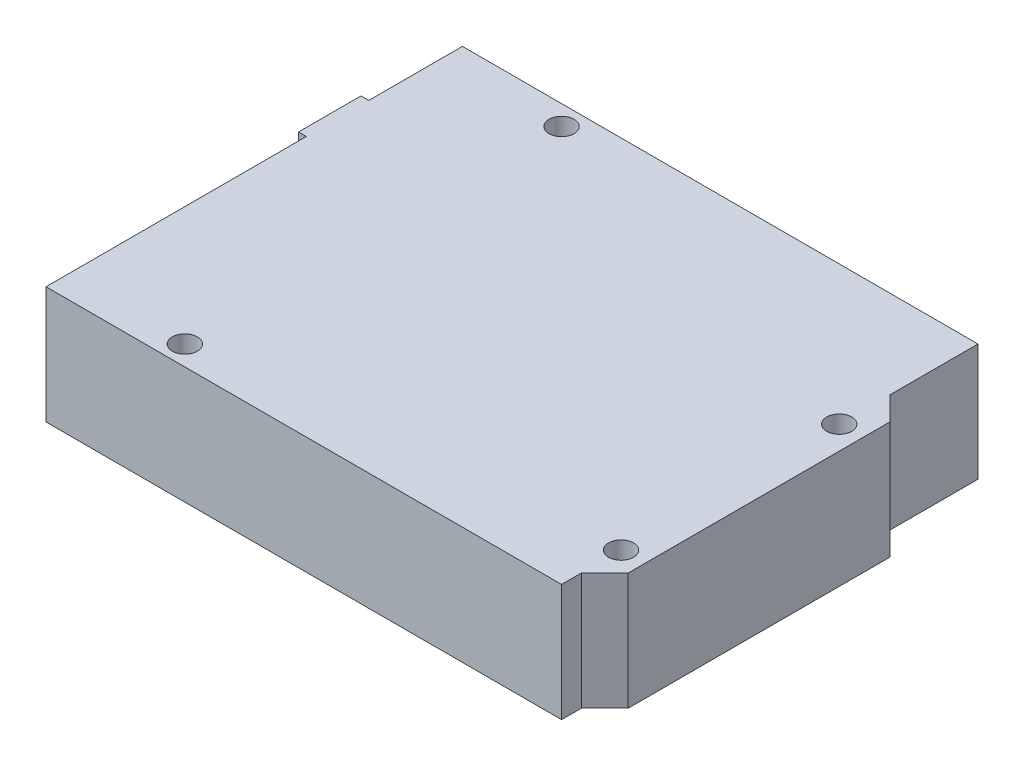
ISO-10303-21;
HEADER;
FILE_DESCRIPTION(('STEP AP214'),'2;1');
FILE_NAME('part.step','',(''),(''),'','','');
FILE_SCHEMA(('AUTOMOTIVE_DESIGN { 1 0 10303 214 1 1 1 1 }'));
ENDSEC;
DATA;
#1=APPLICATION_CONTEXT('core data for automotive mechanical design processes');
#2=APPLICATION_PROTOCOL_DEFINITION('international standard','automotive_design',2000,#1);
#3=PRODUCT_CONTEXT('',#1,'mechanical');
#4=PRODUCT('Part','Part','',(#3));
#5=PRODUCT_RELATED_PRODUCT_CATEGORY('part','',(#4));
#6=PRODUCT_DEFINITION_FORMATION('','',#4);
#7=PRODUCT_DEFINITION_CONTEXT('part definition',#1,'design');
#8=PRODUCT_DEFINITION('design','',#6,#7);
#9=PRODUCT_DEFINITION_SHAPE('','',#8);
#10=(LENGTH_UNIT() NAMED_UNIT(*) SI_UNIT(.MILLI.,.METRE.));
#11=(NAMED_UNIT(*) PLANE_ANGLE_UNIT() SI_UNIT($,.RADIAN.));
#12=(NAMED_UNIT(*) SI_UNIT($,.STERADIAN.) SOLID_ANGLE_UNIT());
#13=UNCERTAINTY_MEASURE_WITH_UNIT(LENGTH_MEASURE(1.E-05),#10,'distance_accuracy_value','');
#14=(GEOMETRIC_REPRESENTATION_CONTEXT(3) GLOBAL_UNCERTAINTY_ASSIGNED_CONTEXT((#13)) GLOBAL_UNIT_ASSIGNED_CONTEXT((#10,
#11,#12)) REPRESENTATION_CONTEXT('',''));
#15=CARTESIAN_POINT('',(0.,0.,0.));
#16=DIRECTION('',(0.,0.,1.));
#17=DIRECTION('',(1.,0.,0.));
#18=AXIS2_PLACEMENT_3D('',#15,#16,#17);
#19=CARTESIAN_POINT('',(0.,15.,0.));
#20=DIRECTION('',(0.,-1.,0.));
#21=DIRECTION('',(0.,0.,-1.));
#22=AXIS2_PLACEMENT_3D('',#19,#20,#21);
#23=PLANE('',#22);
#24=DIRECTION('',(0.,0.,1.));
#25=VECTOR('',#24,1.);
#26=CARTESIAN_POINT('',(0.,15.,-30.8));
#27=LINE('',#26,#25);
#28=CARTESIAN_POINT('',(0.,15.,-30.8));
#29=VERTEX_POINT('',#28);
#30=CARTESIAN_POINT('',(0.,15.,2.54));
#31=VERTEX_POINT('',#30);
#32=EDGE_CURVE('E230',#29,#31,#27,.T.);
#33=ORIENTED_EDGE('',*,*,#32,.T.);
#34=DIRECTION('',(1.,0.,0.));
#35=VECTOR('',#34,1.);
#36=CARTESIAN_POINT('',(0.,15.,2.54));
#37=LINE('',#36,#35);
#38=CARTESIAN_POINT('',(66.04,15.,2.54));
#39=VERTEX_POINT('',#38);
#40=EDGE_CURVE('E232',#31,#39,#37,.T.);
#41=ORIENTED_EDGE('',*,*,#40,.T.);
#42=DIRECTION('',(0.,0.,-1.));
#43=VECTOR('',#42,1.);
#44=CARTESIAN_POINT('',(66.04,15.,2.54));
#45=LINE('',#44,#43);
#46=CARTESIAN_POINT('',(66.04,15.,0.));
#47=VERTEX_POINT('',#46);
#48=EDGE_CURVE('E235',#39,#47,#45,.T.);
#49=ORIENTED_EDGE('',*,*,#48,.T.);
#50=DIRECTION('',(0.707106781186546,0.,-0.707106781186549));
#51=VECTOR('',#50,1.);
#52=CARTESIAN_POINT('',(66.04,15.,0.));
#53=LINE('',#52,#51);
#54=CARTESIAN_POINT('',(69.04,15.,-3.00000000000001));
#55=VERTEX_POINT('',#54);
#56=EDGE_CURVE('E241',#47,#55,#53,.T.);
#57=ORIENTED_EDGE('',*,*,#56,.T.);
#58=DIRECTION('',(0.,0.,-1.));
#59=VECTOR('',#58,1.);
#60=CARTESIAN_POINT('',(69.04,15.,-3.00000000000001));
#61=LINE('',#60,#59);
#62=CARTESIAN_POINT('',(69.04,15.,-36.5));
#63=VERTEX_POINT('',#62);
#64=EDGE_CURVE('E146',#55,#63,#61,.T.);
#65=ORIENTED_EDGE('',*,*,#64,.T.);
#66=DIRECTION('',(-0.707106781186548,0.,-0.707106781186547));
#67=VECTOR('',#66,1.);
#68=CARTESIAN_POINT('',(69.04,15.,-36.5));
#69=LINE('',#68,#67);
#70=CARTESIAN_POINT('',(66.04,15.,-39.5));
#71=VERTEX_POINT('',#70);
#72=EDGE_CURVE('E140',#63,#71,#69,.T.);
#73=ORIENTED_EDGE('',*,*,#72,.T.);
#74=DIRECTION('',(0.,0.,-1.));
#75=VECTOR('',#74,1.);
#76=CARTESIAN_POINT('',(66.04,15.,-50.8));
#77=LINE('',#76,#75);
#78=CARTESIAN_POINT('',(66.04,15.,-50.8));
#79=VERTEX_POINT('',#78);
#80=EDGE_CURVE('E144',#71,#79,#77,.T.);
#81=ORIENTED_EDGE('',*,*,#80,.T.);
#82=DIRECTION('',(-1.,0.,0.));
#83=VECTOR('',#82,1.);
#84=CARTESIAN_POINT('',(66.04,15.,-50.8));
#85=LINE('',#84,#83);
#86=CARTESIAN_POINT('',(0.,15.,-50.8));
#87=VERTEX_POINT('',#86);
#88=EDGE_CURVE('E60',#79,#87,#85,.T.);
#89=ORIENTED_EDGE('',*,*,#88,.T.);
#90=DIRECTION('',(0.,0.,1.));
#91=VECTOR('',#90,1.);
#92=CARTESIAN_POINT('',(0.,15.,-50.8));
#93=LINE('',#92,#91);
#94=CARTESIAN_POINT('',(0.,15.,-38.8));
#95=VERTEX_POINT('',#94);
#96=EDGE_CURVE('E188',#87,#95,#93,.T.);
#97=ORIENTED_EDGE('',*,*,#96,.T.);
#98=DIRECTION('',(-1.,0.,0.));
#99=VECTOR('',#98,1.);
#100=CARTESIAN_POINT('',(0.,15.,-38.8));
#101=LINE('',#100,#99);
#102=CARTESIAN_POINT('',(-1.,15.,-38.8));
#103=VERTEX_POINT('',#102);
#104=EDGE_CURVE('E115',#95,#103,#101,.T.);
#105=ORIENTED_EDGE('',*,*,#104,.T.);
#106=DIRECTION('',(0.,0.,1.));
#107=VECTOR('',#106,1.);
#108=CARTESIAN_POINT('',(-1.,15.,-38.8));
#109=LINE('',#108,#107);
#110=CARTESIAN_POINT('',(-1.,15.,-30.8));
#111=VERTEX_POINT('',#110);
#112=EDGE_CURVE('E215',#103,#111,#109,.T.);
#113=ORIENTED_EDGE('',*,*,#112,.T.);
#114=DIRECTION('',(1.,0.,0.));
#115=VECTOR('',#114,1.);
#116=CARTESIAN_POINT('',(-1.,15.,-30.8));
#117=LINE('',#116,#115);
#118=EDGE_CURVE('E233',#111,#29,#117,.T.);
#119=ORIENTED_EDGE('',*,*,#118,.T.);
#120=EDGE_LOOP('',(#33,#41,#49,#57,#65,#73,#81,#89,#97,#105,#113,#119));
#121=FACE_BOUND('',#120,.T.);
#122=CARTESIAN_POINT('',(15.24,15.,0.));
#123=DIRECTION('',(0.,1.,0.));
#124=DIRECTION('',(0.,0.,1.));
#125=AXIS2_PLACEMENT_3D('',#122,#123,#124);
#126=CIRCLE('',#125,1.6);
#127=CARTESIAN_POINT('',(15.24,15.,1.6));
#128=VERTEX_POINT('',#127);
#129=EDGE_CURVE('E168',#128,#128,#126,.T.);
#130=ORIENTED_EDGE('',*,*,#129,.F.);
#131=EDGE_LOOP('',(#130));
#132=FACE_BOUND('',#131,.T.);
#133=CARTESIAN_POINT('',(66.04,15.,-33.02));
#134=DIRECTION('',(0.,1.,0.));
#135=DIRECTION('',(0.,0.,1.));
#136=AXIS2_PLACEMENT_3D('',#133,#134,#135);
#137=CIRCLE('',#136,1.60000000000001);
#138=CARTESIAN_POINT('',(66.04,15.,-31.42));
#139=VERTEX_POINT('',#138);
#140=EDGE_CURVE('E305',#139,#139,#137,.T.);
#141=ORIENTED_EDGE('',*,*,#140,.F.);
#142=EDGE_LOOP('',(#141));
#143=FACE_BOUND('',#142,.T.);
#144=CARTESIAN_POINT('',(66.04,15.,-5.08000000000001));
#145=DIRECTION('',(0.,1.,0.));
#146=DIRECTION('',(0.,0.,1.));
#147=AXIS2_PLACEMENT_3D('',#144,#145,#146);
#148=CIRCLE('',#147,1.60000000000001);
#149=CARTESIAN_POINT('',(66.04,15.,-3.48));
#150=VERTEX_POINT('',#149);
#151=EDGE_CURVE('E299',#150,#150,#148,.T.);
#152=ORIENTED_EDGE('',*,*,#151,.F.);
#153=EDGE_LOOP('',(#152));
#154=FACE_BOUND('',#153,.T.);
#155=CARTESIAN_POINT('',(15.24,15.,-48.26));
#156=DIRECTION('',(0.,1.,0.));
#157=DIRECTION('',(0.,0.,1.));
#158=AXIS2_PLACEMENT_3D('',#155,#156,#157);
#159=CIRCLE('',#158,1.6);
#160=CARTESIAN_POINT('',(15.24,15.,-46.66));
#161=VERTEX_POINT('',#160);
#162=EDGE_CURVE('E290',#161,#161,#159,.T.);
#163=ORIENTED_EDGE('',*,*,#162,.F.);
#164=EDGE_LOOP('',(#163));
#165=FACE_BOUND('',#164,.T.);
#166=ADVANCED_FACE('F43',(#121,#132,#143,#154,#165),#23,.F.);
#167=CARTESIAN_POINT('',(0.,0.,0.));
#168=DIRECTION('',(0.,-1.,0.));
#169=DIRECTION('',(0.,0.,-1.));
#170=AXIS2_PLACEMENT_3D('',#167,#168,#169);
#171=PLANE('',#170);
#172=DIRECTION('',(0.,0.,1.));
#173=VECTOR('',#172,1.);
#174=CARTESIAN_POINT('',(0.,0.,0.));
#175=LINE('',#174,#173);
#176=CARTESIAN_POINT('',(0.,0.,-30.8));
#177=VERTEX_POINT('',#176);
#178=CARTESIAN_POINT('',(0.,0.,2.54));
#179=VERTEX_POINT('',#178);
#180=EDGE_CURVE('E175',#177,#179,#175,.T.);
#181=ORIENTED_EDGE('',*,*,#180,.F.);
#182=DIRECTION('',(1.,0.,0.));
#183=VECTOR('',#182,1.);
#184=CARTESIAN_POINT('',(-1.,0.,-30.8));
#185=LINE('',#184,#183);
#186=CARTESIAN_POINT('',(-1.,0.,-30.8));
#187=VERTEX_POINT('',#186);
#188=EDGE_CURVE('E172',#187,#177,#185,.T.);
#189=ORIENTED_EDGE('',*,*,#188,.F.);
#190=DIRECTION('',(0.,0.,1.));
#191=VECTOR('',#190,1.);
#192=CARTESIAN_POINT('',(-1.,0.,-38.8));
#193=LINE('',#192,#191);
#194=CARTESIAN_POINT('',(-1.,0.,-38.8));
#195=VERTEX_POINT('',#194);
#196=EDGE_CURVE('E170',#195,#187,#193,.T.);
#197=ORIENTED_EDGE('',*,*,#196,.F.);
#198=DIRECTION('',(-1.,0.,0.));
#199=VECTOR('',#198,1.);
#200=CARTESIAN_POINT('',(0.,0.,-38.8));
#201=LINE('',#200,#199);
#202=CARTESIAN_POINT('',(0.,0.,-38.8));
#203=VERTEX_POINT('',#202);
#204=EDGE_CURVE('E167',#203,#195,#201,.T.);
#205=ORIENTED_EDGE('',*,*,#204,.F.);
#206=DIRECTION('',(0.,0.,1.));
#207=VECTOR('',#206,1.);
#208=CARTESIAN_POINT('',(0.,0.,-50.8));
#209=LINE('',#208,#207);
#210=CARTESIAN_POINT('',(0.,0.,-50.8));
#211=VERTEX_POINT('',#210);
#212=EDGE_CURVE('E164',#211,#203,#209,.T.);
#213=ORIENTED_EDGE('',*,*,#212,.F.);
#214=DIRECTION('',(-1.,0.,0.));
#215=VECTOR('',#214,1.);
#216=CARTESIAN_POINT('',(66.04,0.,-50.8));
#217=LINE('',#216,#215);
#218=CARTESIAN_POINT('',(66.04,0.,-50.8));
#219=VERTEX_POINT('',#218);
#220=EDGE_CURVE('E107',#219,#211,#217,.T.);
#221=ORIENTED_EDGE('',*,*,#220,.F.);
#222=DIRECTION('',(0.,0.,-1.));
#223=VECTOR('',#222,1.);
#224=CARTESIAN_POINT('',(66.04,0.,-50.8));
#225=LINE('',#224,#223);
#226=CARTESIAN_POINT('',(66.04,0.,-39.5));
#227=VERTEX_POINT('',#226);
#228=EDGE_CURVE('E101',#227,#219,#225,.T.);
#229=ORIENTED_EDGE('',*,*,#228,.F.);
#230=DIRECTION('',(-0.707106781186548,0.,-0.707106781186547));
#231=VECTOR('',#230,1.);
#232=CARTESIAN_POINT('',(69.04,0.,-36.5));
#233=LINE('',#232,#231);
#234=CARTESIAN_POINT('',(69.04,0.,-36.5));
#235=VERTEX_POINT('',#234);
#236=EDGE_CURVE('E154',#235,#227,#233,.T.);
#237=ORIENTED_EDGE('',*,*,#236,.F.);
#238=DIRECTION('',(0.,0.,-1.));
#239=VECTOR('',#238,1.);
#240=CARTESIAN_POINT('',(69.04,0.,-3.00000000000001));
#241=LINE('',#240,#239);
#242=CARTESIAN_POINT('',(69.04,0.,-3.00000000000001));
#243=VERTEX_POINT('',#242);
#244=EDGE_CURVE('E183',#243,#235,#241,.T.);
#245=ORIENTED_EDGE('',*,*,#244,.F.);
#246=DIRECTION('',(0.707106781186546,0.,-0.707106781186549));
#247=VECTOR('',#246,1.);
#248=CARTESIAN_POINT('',(66.04,0.,0.));
#249=LINE('',#248,#247);
#250=CARTESIAN_POINT('',(66.04,0.,0.));
#251=VERTEX_POINT('',#250);
#252=EDGE_CURVE('E181',#251,#243,#249,.T.);
#253=ORIENTED_EDGE('',*,*,#252,.F.);
#254=DIRECTION('',(0.,0.,-1.));
#255=VECTOR('',#254,1.);
#256=CARTESIAN_POINT('',(66.04,0.,2.54));
#257=LINE('',#256,#255);
#258=CARTESIAN_POINT('',(66.04,0.,2.54));
#259=VERTEX_POINT('',#258);
#260=EDGE_CURVE('E179',#259,#251,#257,.T.);
#261=ORIENTED_EDGE('',*,*,#260,.F.);
#262=DIRECTION('',(1.,0.,0.));
#263=VECTOR('',#262,1.);
#264=CARTESIAN_POINT('',(0.,0.,2.54));
#265=LINE('',#264,#263);
#266=EDGE_CURVE('E177',#179,#259,#265,.T.);
#267=ORIENTED_EDGE('',*,*,#266,.F.);
#268=EDGE_LOOP('',(#181,#189,#197,#205,#213,#221,#229,#237,#245,#253,#261,#267));
#269=FACE_BOUND('',#268,.T.);
#270=CARTESIAN_POINT('',(66.04,0.,-5.08000000000001));
#271=DIRECTION('',(0.,1.,0.));
#272=DIRECTION('',(0.,0.,1.));
#273=AXIS2_PLACEMENT_3D('',#270,#271,#272);
#274=CIRCLE('',#273,1.60000000000001);
#275=CARTESIAN_POINT('',(66.04,0.,-3.48));
#276=VERTEX_POINT('',#275);
#277=EDGE_CURVE('E296',#276,#276,#274,.T.);
#278=ORIENTED_EDGE('',*,*,#277,.T.);
#279=EDGE_LOOP('',(#278));
#280=FACE_BOUND('',#279,.T.);
#281=CARTESIAN_POINT('',(15.24,0.,0.));
#282=DIRECTION('',(0.,1.,0.));
#283=DIRECTION('',(0.,0.,1.));
#284=AXIS2_PLACEMENT_3D('',#281,#282,#283);
#285=CIRCLE('',#284,1.6);
#286=CARTESIAN_POINT('',(15.24,0.,1.6));
#287=VERTEX_POINT('',#286);
#288=EDGE_CURVE('E308',#287,#287,#285,.T.);
#289=ORIENTED_EDGE('',*,*,#288,.T.);
#290=EDGE_LOOP('',(#289));
#291=FACE_BOUND('',#290,.T.);
#292=CARTESIAN_POINT('',(66.04,0.,-33.02));
#293=DIRECTION('',(0.,1.,0.));
#294=DIRECTION('',(0.,0.,1.));
#295=AXIS2_PLACEMENT_3D('',#292,#293,#294);
#296=CIRCLE('',#295,1.60000000000001);
#297=CARTESIAN_POINT('',(66.04,0.,-31.42));
#298=VERTEX_POINT('',#297);
#299=EDGE_CURVE('E302',#298,#298,#296,.T.);
#300=ORIENTED_EDGE('',*,*,#299,.T.);
#301=EDGE_LOOP('',(#300));
#302=FACE_BOUND('',#301,.T.);
#303=CARTESIAN_POINT('',(15.24,0.,-48.26));
#304=DIRECTION('',(0.,1.,0.));
#305=DIRECTION('',(0.,0.,1.));
#306=AXIS2_PLACEMENT_3D('',#303,#304,#305);
#307=CIRCLE('',#306,1.6);
#308=CARTESIAN_POINT('',(15.24,0.,-46.66));
#309=VERTEX_POINT('',#308);
#310=EDGE_CURVE('E293',#309,#309,#307,.T.);
#311=ORIENTED_EDGE('',*,*,#310,.T.);
#312=EDGE_LOOP('',(#311));
#313=FACE_BOUND('',#312,.T.);
#314=ADVANCED_FACE('F218',(#269,#280,#291,#302,#313),#171,.T.);
#315=CARTESIAN_POINT('',(0.,15.,-50.8));
#316=DIRECTION('',(1.,0.,0.));
#317=DIRECTION('',(0.,0.,-1.));
#318=AXIS2_PLACEMENT_3D('',#315,#316,#317);
#319=PLANE('',#318);
#320=ORIENTED_EDGE('',*,*,#212,.T.);
#321=DIRECTION('',(0.,-1.,0.));
#322=VECTOR('',#321,1.);
#323=CARTESIAN_POINT('',(0.,15.,-38.8));
#324=LINE('',#323,#322);
#325=EDGE_CURVE('E11',#95,#203,#324,.T.);
#326=ORIENTED_EDGE('',*,*,#325,.F.);
#327=ORIENTED_EDGE('',*,*,#96,.F.);
#328=DIRECTION('',(0.,-1.,0.));
#329=VECTOR('',#328,1.);
#330=CARTESIAN_POINT('',(0.,15.,-50.8));
#331=LINE('',#330,#329);
#332=EDGE_CURVE('E160',#87,#211,#331,.T.);
#333=ORIENTED_EDGE('',*,*,#332,.T.);
#334=EDGE_LOOP('',(#320,#326,#327,#333));
#335=FACE_BOUND('',#334,.T.);
#336=ADVANCED_FACE('F45',(#335),#319,.F.);
#337=CARTESIAN_POINT('',(0.,15.,-38.8));
#338=DIRECTION('',(0.,0.,1.));
#339=DIRECTION('',(1.,0.,0.));
#340=AXIS2_PLACEMENT_3D('',#337,#338,#339);
#341=PLANE('',#340);
#342=ORIENTED_EDGE('',*,*,#204,.T.);
#343=DIRECTION('',(0.,-1.,0.));
#344=VECTOR('',#343,1.);
#345=CARTESIAN_POINT('',(-1.,15.,-38.8));
#346=LINE('',#345,#344);
#347=EDGE_CURVE('E52',#103,#195,#346,.T.);
#348=ORIENTED_EDGE('',*,*,#347,.F.);
#349=ORIENTED_EDGE('',*,*,#104,.F.);
#350=ORIENTED_EDGE('',*,*,#325,.T.);
#351=EDGE_LOOP('',(#342,#348,#349,#350));
#352=FACE_BOUND('',#351,.T.);
#353=ADVANCED_FACE('F357',(#352),#341,.F.);
#354=CARTESIAN_POINT('',(-1.,15.,-38.8));
#355=DIRECTION('',(1.,0.,0.));
#356=DIRECTION('',(0.,0.,-1.));
#357=AXIS2_PLACEMENT_3D('',#354,#355,#356);
#358=PLANE('',#357);
#359=ORIENTED_EDGE('',*,*,#196,.T.);
#360=DIRECTION('',(0.,-1.,0.));
#361=VECTOR('',#360,1.);
#362=CARTESIAN_POINT('',(-1.,15.,-30.8));
#363=LINE('',#362,#361);
#364=EDGE_CURVE('E207',#111,#187,#363,.T.);
#365=ORIENTED_EDGE('',*,*,#364,.F.);
#366=ORIENTED_EDGE('',*,*,#112,.F.);
#367=ORIENTED_EDGE('',*,*,#347,.T.);
#368=EDGE_LOOP('',(#359,#365,#366,#367));
#369=FACE_BOUND('',#368,.T.);
#370=ADVANCED_FACE('F213',(#369),#358,.F.);
#371=CARTESIAN_POINT('',(-1.,15.,-30.8));
#372=DIRECTION('',(0.,0.,-1.));
#373=DIRECTION('',(-1.,0.,0.));
#374=AXIS2_PLACEMENT_3D('',#371,#372,#373);
#375=PLANE('',#374);
#376=ORIENTED_EDGE('',*,*,#188,.T.);
#377=DIRECTION('',(0.,-1.,0.));
#378=VECTOR('',#377,1.);
#379=CARTESIAN_POINT('',(0.,15.,-30.8));
#380=LINE('',#379,#378);
#381=EDGE_CURVE('E204',#29,#177,#380,.T.);
#382=ORIENTED_EDGE('',*,*,#381,.F.);
#383=ORIENTED_EDGE('',*,*,#118,.F.);
#384=ORIENTED_EDGE('',*,*,#364,.T.);
#385=EDGE_LOOP('',(#376,#382,#383,#384));
#386=FACE_BOUND('',#385,.T.);
#387=ADVANCED_FACE('F224',(#386),#375,.F.);
#388=CARTESIAN_POINT('',(0.,15.,0.));
#389=DIRECTION('',(1.,0.,0.));
#390=DIRECTION('',(0.,0.,-1.));
#391=AXIS2_PLACEMENT_3D('',#388,#389,#390);
#392=PLANE('',#391);
#393=ORIENTED_EDGE('',*,*,#180,.T.);
#394=DIRECTION('',(0.,-1.,0.));
#395=VECTOR('',#394,1.);
#396=CARTESIAN_POINT('',(0.,15.,2.54));
#397=LINE('',#396,#395);
#398=EDGE_CURVE('E201',#31,#179,#397,.T.);
#399=ORIENTED_EDGE('',*,*,#398,.F.);
#400=ORIENTED_EDGE('',*,*,#32,.F.);
#401=ORIENTED_EDGE('',*,*,#381,.T.);
#402=EDGE_LOOP('',(#393,#399,#400,#401));
#403=FACE_BOUND('',#402,.T.);
#404=ADVANCED_FACE('F228',(#403),#392,.F.);
#405=CARTESIAN_POINT('',(0.,15.,2.54));
#406=DIRECTION('',(0.,0.,-1.));
#407=DIRECTION('',(-1.,0.,0.));
#408=AXIS2_PLACEMENT_3D('',#405,#406,#407);
#409=PLANE('',#408);
#410=ORIENTED_EDGE('',*,*,#266,.T.);
#411=DIRECTION('',(0.,-1.,0.));
#412=VECTOR('',#411,1.);
#413=CARTESIAN_POINT('',(66.04,15.,2.54));
#414=LINE('',#413,#412);
#415=EDGE_CURVE('E198',#39,#259,#414,.T.);
#416=ORIENTED_EDGE('',*,*,#415,.F.);
#417=ORIENTED_EDGE('',*,*,#40,.F.);
#418=ORIENTED_EDGE('',*,*,#398,.T.);
#419=EDGE_LOOP('',(#410,#416,#417,#418));
#420=FACE_BOUND('',#419,.T.);
#421=ADVANCED_FACE('F336',(#420),#409,.F.);
#422=CARTESIAN_POINT('',(66.04,15.,2.54));
#423=DIRECTION('',(-1.,0.,0.));
#424=DIRECTION('',(0.,0.,1.));
#425=AXIS2_PLACEMENT_3D('',#422,#423,#424);
#426=PLANE('',#425);
#427=ORIENTED_EDGE('',*,*,#260,.T.);
#428=DIRECTION('',(0.,-1.,0.));
#429=VECTOR('',#428,1.);
#430=CARTESIAN_POINT('',(66.04,15.,0.));
#431=LINE('',#430,#429);
#432=EDGE_CURVE('E195',#47,#251,#431,.T.);
#433=ORIENTED_EDGE('',*,*,#432,.F.);
#434=ORIENTED_EDGE('',*,*,#48,.F.);
#435=ORIENTED_EDGE('',*,*,#415,.T.);
#436=EDGE_LOOP('',(#427,#433,#434,#435));
#437=FACE_BOUND('',#436,.T.);
#438=ADVANCED_FACE('F379',(#437),#426,.F.);
#439=CARTESIAN_POINT('',(66.04,15.,0.));
#440=DIRECTION('',(-0.707106781186549,0.,-0.707106781186546));
#441=DIRECTION('',(-0.707106781186546,0.,0.707106781186549));
#442=AXIS2_PLACEMENT_3D('',#439,#440,#441);
#443=PLANE('',#442);
#444=ORIENTED_EDGE('',*,*,#252,.T.);
#445=DIRECTION('',(0.,-1.,0.));
#446=VECTOR('',#445,1.);
#447=CARTESIAN_POINT('',(69.04,15.,-3.00000000000001));
#448=LINE('',#447,#446);
#449=EDGE_CURVE('E192',#55,#243,#448,.T.);
#450=ORIENTED_EDGE('',*,*,#449,.F.);
#451=ORIENTED_EDGE('',*,*,#56,.F.);
#452=ORIENTED_EDGE('',*,*,#432,.T.);
#453=EDGE_LOOP('',(#444,#450,#451,#452));
#454=FACE_BOUND('',#453,.T.);
#455=ADVANCED_FACE('F247',(#454),#443,.F.);
#456=CARTESIAN_POINT('',(69.04,15.,-3.00000000000001));
#457=DIRECTION('',(-1.,0.,0.));
#458=DIRECTION('',(0.,0.,1.));
#459=AXIS2_PLACEMENT_3D('',#456,#457,#458);
#460=PLANE('',#459);
#461=ORIENTED_EDGE('',*,*,#244,.T.);
#462=DIRECTION('',(0.,-1.,0.));
#463=VECTOR('',#462,1.);
#464=CARTESIAN_POINT('',(69.04,15.,-36.5));
#465=LINE('',#464,#463);
#466=EDGE_CURVE('E155',#63,#235,#465,.T.);
#467=ORIENTED_EDGE('',*,*,#466,.F.);
#468=ORIENTED_EDGE('',*,*,#64,.F.);
#469=ORIENTED_EDGE('',*,*,#449,.T.);
#470=EDGE_LOOP('',(#461,#467,#468,#469));
#471=FACE_BOUND('',#470,.T.);
#472=ADVANCED_FACE('F251',(#471),#460,.F.);
#473=CARTESIAN_POINT('',(69.04,15.,-36.5));
#474=DIRECTION('',(-0.707106781186547,0.,0.707106781186548));
#475=DIRECTION('',(0.707106781186548,0.,0.707106781186547));
#476=AXIS2_PLACEMENT_3D('',#473,#474,#475);
#477=PLANE('',#476);
#478=ORIENTED_EDGE('',*,*,#236,.T.);
#479=DIRECTION('',(0.,-1.,0.));
#480=VECTOR('',#479,1.);
#481=CARTESIAN_POINT('',(66.04,15.,-39.5));
#482=LINE('',#481,#480);
#483=EDGE_CURVE('E151',#71,#227,#482,.T.);
#484=ORIENTED_EDGE('',*,*,#483,.F.);
#485=ORIENTED_EDGE('',*,*,#72,.F.);
#486=ORIENTED_EDGE('',*,*,#466,.T.);
#487=EDGE_LOOP('',(#478,#484,#485,#486));
#488=FACE_BOUND('',#487,.T.);
#489=ADVANCED_FACE('F152',(#488),#477,.F.);
#490=CARTESIAN_POINT('',(66.04,15.,-50.8));
#491=DIRECTION('',(-1.,0.,0.));
#492=DIRECTION('',(0.,0.,1.));
#493=AXIS2_PLACEMENT_3D('',#490,#491,#492);
#494=PLANE('',#493);
#495=ORIENTED_EDGE('',*,*,#228,.T.);
#496=DIRECTION('',(0.,-1.,0.));
#497=VECTOR('',#496,1.);
#498=CARTESIAN_POINT('',(66.04,15.,-50.8));
#499=LINE('',#498,#497);
#500=EDGE_CURVE('E156',#79,#219,#499,.T.);
#501=ORIENTED_EDGE('',*,*,#500,.F.);
#502=ORIENTED_EDGE('',*,*,#80,.F.);
#503=ORIENTED_EDGE('',*,*,#483,.T.);
#504=EDGE_LOOP('',(#495,#501,#502,#503));
#505=FACE_BOUND('',#504,.T.);
#506=ADVANCED_FACE('F158',(#505),#494,.F.);
#507=CARTESIAN_POINT('',(66.04,15.,-50.8));
#508=DIRECTION('',(0.,0.,1.));
#509=DIRECTION('',(1.,0.,0.));
#510=AXIS2_PLACEMENT_3D('',#507,#508,#509);
#511=PLANE('',#510);
#512=ORIENTED_EDGE('',*,*,#220,.T.);
#513=ORIENTED_EDGE('',*,*,#332,.F.);
#514=ORIENTED_EDGE('',*,*,#88,.F.);
#515=ORIENTED_EDGE('',*,*,#500,.T.);
#516=EDGE_LOOP('',(#512,#513,#514,#515));
#517=FACE_BOUND('',#516,.T.);
#518=ADVANCED_FACE('F255',(#517),#511,.F.);
#519=CARTESIAN_POINT('',(15.24,15.,0.));
#520=DIRECTION('',(0.,-1.,0.));
#521=DIRECTION('',(0.,0.,-1.));
#522=AXIS2_PLACEMENT_3D('',#519,#520,#521);
#523=CYLINDRICAL_SURFACE('',#522,1.6);
#524=ORIENTED_EDGE('',*,*,#129,.T.);
#525=EDGE_LOOP('',(#524));
#526=FACE_BOUND('',#525,.T.);
#527=ORIENTED_EDGE('',*,*,#288,.F.);
#528=EDGE_LOOP('',(#527));
#529=FACE_BOUND('',#528,.T.);
#530=ADVANCED_FACE('F257',(#526,#529),#523,.F.);
#531=CARTESIAN_POINT('',(66.04,15.,-33.02));
#532=DIRECTION('',(0.,-1.,0.));
#533=DIRECTION('',(0.,0.,-1.));
#534=AXIS2_PLACEMENT_3D('',#531,#532,#533);
#535=CYLINDRICAL_SURFACE('',#534,1.60000000000001);
#536=ORIENTED_EDGE('',*,*,#140,.T.);
#537=EDGE_LOOP('',(#536));
#538=FACE_BOUND('',#537,.T.);
#539=ORIENTED_EDGE('',*,*,#299,.F.);
#540=EDGE_LOOP('',(#539));
#541=FACE_BOUND('',#540,.T.);
#542=ADVANCED_FACE('F263',(#538,#541),#535,.F.);
#543=CARTESIAN_POINT('',(66.04,15.,-5.08000000000001));
#544=DIRECTION('',(0.,-1.,0.));
#545=DIRECTION('',(0.,0.,-1.));
#546=AXIS2_PLACEMENT_3D('',#543,#544,#545);
#547=CYLINDRICAL_SURFACE('',#546,1.60000000000001);
#548=ORIENTED_EDGE('',*,*,#151,.T.);
#549=EDGE_LOOP('',(#548));
#550=FACE_BOUND('',#549,.T.);
#551=ORIENTED_EDGE('',*,*,#277,.F.);
#552=EDGE_LOOP('',(#551));
#553=FACE_BOUND('',#552,.T.);
#554=ADVANCED_FACE('F277',(#550,#553),#547,.F.);
#555=CARTESIAN_POINT('',(15.24,15.,-48.26));
#556=DIRECTION('',(0.,-1.,0.));
#557=DIRECTION('',(0.,0.,-1.));
#558=AXIS2_PLACEMENT_3D('',#555,#556,#557);
#559=CYLINDRICAL_SURFACE('',#558,1.6);
#560=ORIENTED_EDGE('',*,*,#162,.T.);
#561=EDGE_LOOP('',(#560));
#562=FACE_BOUND('',#561,.T.);
#563=ORIENTED_EDGE('',*,*,#310,.F.);
#564=EDGE_LOOP('',(#563));
#565=FACE_BOUND('',#564,.T.);
#566=ADVANCED_FACE('F281',(#562,#565),#559,.F.);
#567=CLOSED_SHELL('',(#166,#314,#336,#353,#370,#387,#404,#421,#438,#455,#472,#489,#506,#518,
#530,#542,#554,#566));
#568=MANIFOLD_SOLID_BREP('B2',#567);
#569=ADVANCED_BREP_SHAPE_REPRESENTATION('',(#18,#568),#14);
#570=SHAPE_DEFINITION_REPRESENTATION(#9,#569);
ENDSEC;
END-ISO-10303-21;
